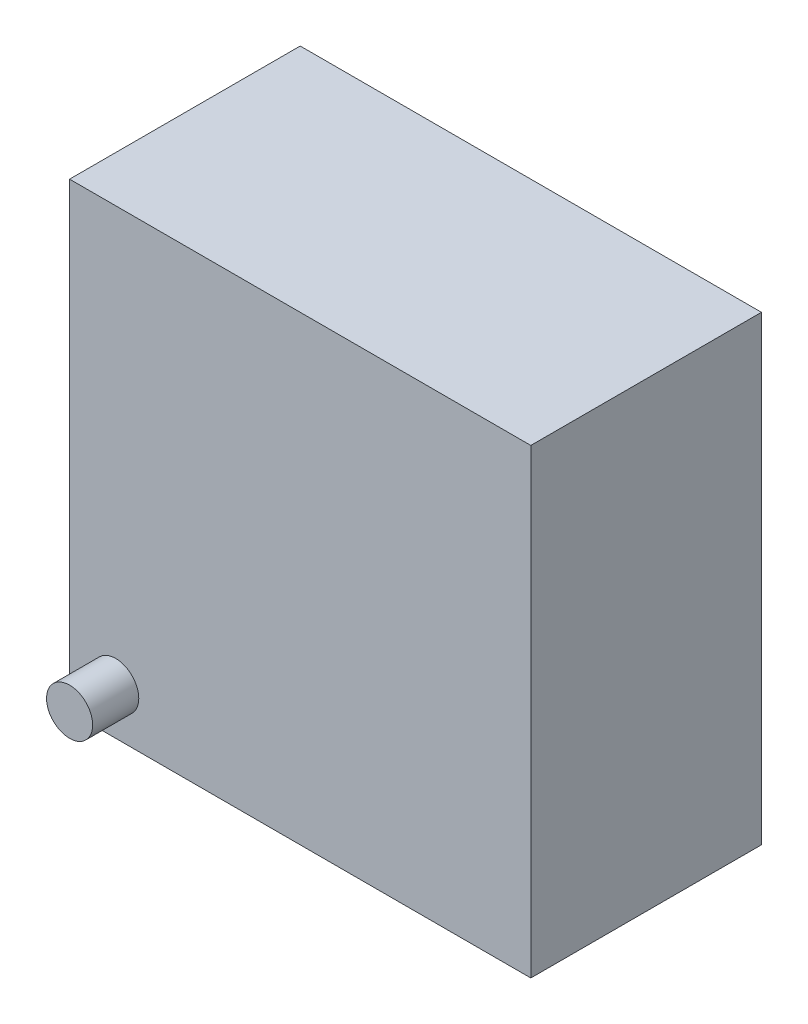
ISO-10303-21;
HEADER;
FILE_DESCRIPTION(('STEP AP214'),'2;1');
FILE_NAME('part.step','',(''),(''),'','','');
FILE_SCHEMA(('AUTOMOTIVE_DESIGN { 1 0 10303 214 1 1 1 1 }'));
ENDSEC;
DATA;
#1=APPLICATION_CONTEXT('core data for automotive mechanical design processes');
#2=APPLICATION_PROTOCOL_DEFINITION('international standard','automotive_design',2000,#1);
#3=PRODUCT_CONTEXT('',#1,'mechanical');
#4=PRODUCT('Part','Part','',(#3));
#5=PRODUCT_RELATED_PRODUCT_CATEGORY('part','',(#4));
#6=PRODUCT_DEFINITION_FORMATION('','',#4);
#7=PRODUCT_DEFINITION_CONTEXT('part definition',#1,'design');
#8=PRODUCT_DEFINITION('design','',#6,#7);
#9=PRODUCT_DEFINITION_SHAPE('','',#8);
#10=(LENGTH_UNIT() NAMED_UNIT(*) SI_UNIT(.MILLI.,.METRE.));
#11=(NAMED_UNIT(*) PLANE_ANGLE_UNIT() SI_UNIT($,.RADIAN.));
#12=(NAMED_UNIT(*) SI_UNIT($,.STERADIAN.) SOLID_ANGLE_UNIT());
#13=UNCERTAINTY_MEASURE_WITH_UNIT(LENGTH_MEASURE(1.E-05),#10,'distance_accuracy_value','');
#14=(GEOMETRIC_REPRESENTATION_CONTEXT(3) GLOBAL_UNCERTAINTY_ASSIGNED_CONTEXT((#13)) GLOBAL_UNIT_ASSIGNED_CONTEXT((#10,
#11,#12)) REPRESENTATION_CONTEXT('',''));
#15=CARTESIAN_POINT('',(0.,0.,0.));
#16=DIRECTION('',(0.,0.,1.));
#17=DIRECTION('',(1.,0.,0.));
#18=AXIS2_PLACEMENT_3D('',#15,#16,#17);
#19=CARTESIAN_POINT('',(0.,0.,10.));
#20=DIRECTION('',(1.,0.,0.));
#21=DIRECTION('',(0.,0.,-1.));
#22=AXIS2_PLACEMENT_3D('',#19,#20,#21);
#23=PLANE('',#22);
#24=DIRECTION('',(0.,-1.,0.));
#25=VECTOR('',#24,1.);
#26=CARTESIAN_POINT('',(0.,0.,0.));
#27=LINE('',#26,#25);
#28=CARTESIAN_POINT('',(0.,20.,0.));
#29=VERTEX_POINT('',#28);
#30=CARTESIAN_POINT('',(0.,0.,0.));
#31=VERTEX_POINT('',#30);
#32=EDGE_CURVE('E110',#29,#31,#27,.T.);
#33=ORIENTED_EDGE('',*,*,#32,.T.);
#34=DIRECTION('',(0.,0.,-1.));
#35=VECTOR('',#34,1.);
#36=CARTESIAN_POINT('',(0.,0.,10.));
#37=LINE('',#36,#35);
#38=CARTESIAN_POINT('',(0.,0.,10.));
#39=VERTEX_POINT('',#38);
#40=EDGE_CURVE('E42',#39,#31,#37,.T.);
#41=ORIENTED_EDGE('',*,*,#40,.F.);
#42=DIRECTION('',(0.,-1.,0.));
#43=VECTOR('',#42,1.);
#44=CARTESIAN_POINT('',(0.,0.,10.));
#45=LINE('',#44,#43);
#46=CARTESIAN_POINT('',(0.,20.,10.));
#47=VERTEX_POINT('',#46);
#48=EDGE_CURVE('E94',#47,#39,#45,.T.);
#49=ORIENTED_EDGE('',*,*,#48,.F.);
#50=DIRECTION('',(0.,0.,-1.));
#51=VECTOR('',#50,1.);
#52=CARTESIAN_POINT('',(0.,20.,10.));
#53=LINE('',#52,#51);
#54=EDGE_CURVE('E103',#47,#29,#53,.T.);
#55=ORIENTED_EDGE('',*,*,#54,.T.);
#56=EDGE_LOOP('',(#33,#41,#49,#55));
#57=FACE_BOUND('',#56,.T.);
#58=ADVANCED_FACE('F41',(#57),#23,.F.);
#59=CARTESIAN_POINT('',(0.,0.,10.));
#60=DIRECTION('',(0.,1.,0.));
#61=DIRECTION('',(0.,0.,1.));
#62=AXIS2_PLACEMENT_3D('',#59,#60,#61);
#63=PLANE('',#62);
#64=DIRECTION('',(1.,0.,0.));
#65=VECTOR('',#64,1.);
#66=CARTESIAN_POINT('',(0.,0.,0.));
#67=LINE('',#66,#65);
#68=CARTESIAN_POINT('',(20.,0.,0.));
#69=VERTEX_POINT('',#68);
#70=EDGE_CURVE('E97',#31,#69,#67,.T.);
#71=ORIENTED_EDGE('',*,*,#70,.T.);
#72=DIRECTION('',(0.,0.,-1.));
#73=VECTOR('',#72,1.);
#74=CARTESIAN_POINT('',(20.,0.,10.));
#75=LINE('',#74,#73);
#76=CARTESIAN_POINT('',(20.,0.,10.));
#77=VERTEX_POINT('',#76);
#78=EDGE_CURVE('E100',#77,#69,#75,.T.);
#79=ORIENTED_EDGE('',*,*,#78,.F.);
#80=DIRECTION('',(1.,0.,0.));
#81=VECTOR('',#80,1.);
#82=CARTESIAN_POINT('',(0.,0.,10.));
#83=LINE('',#82,#81);
#84=EDGE_CURVE('E90',#39,#77,#83,.T.);
#85=ORIENTED_EDGE('',*,*,#84,.F.);
#86=ORIENTED_EDGE('',*,*,#40,.T.);
#87=EDGE_LOOP('',(#71,#79,#85,#86));
#88=FACE_BOUND('',#87,.T.);
#89=ADVANCED_FACE('F98',(#88),#63,.F.);
#90=CARTESIAN_POINT('',(20.,0.,10.));
#91=DIRECTION('',(-1.,0.,0.));
#92=DIRECTION('',(0.,0.,1.));
#93=AXIS2_PLACEMENT_3D('',#90,#91,#92);
#94=PLANE('',#93);
#95=DIRECTION('',(0.,1.,0.));
#96=VECTOR('',#95,1.);
#97=CARTESIAN_POINT('',(20.,0.,0.));
#98=LINE('',#97,#96);
#99=CARTESIAN_POINT('',(20.,20.,0.));
#100=VERTEX_POINT('',#99);
#101=EDGE_CURVE('E73',#69,#100,#98,.T.);
#102=ORIENTED_EDGE('',*,*,#101,.T.);
#103=DIRECTION('',(0.,0.,-1.));
#104=VECTOR('',#103,1.);
#105=CARTESIAN_POINT('',(20.,20.,10.));
#106=LINE('',#105,#104);
#107=CARTESIAN_POINT('',(20.,20.,10.));
#108=VERTEX_POINT('',#107);
#109=EDGE_CURVE('E99',#108,#100,#106,.T.);
#110=ORIENTED_EDGE('',*,*,#109,.F.);
#111=DIRECTION('',(0.,1.,0.));
#112=VECTOR('',#111,1.);
#113=CARTESIAN_POINT('',(20.,0.,10.));
#114=LINE('',#113,#112);
#115=EDGE_CURVE('E95',#77,#108,#114,.T.);
#116=ORIENTED_EDGE('',*,*,#115,.F.);
#117=ORIENTED_EDGE('',*,*,#78,.T.);
#118=EDGE_LOOP('',(#102,#110,#116,#117));
#119=FACE_BOUND('',#118,.T.);
#120=ADVANCED_FACE('F101',(#119),#94,.F.);
#121=CARTESIAN_POINT('',(0.,20.,10.));
#122=DIRECTION('',(0.,-1.,0.));
#123=DIRECTION('',(0.,0.,-1.));
#124=AXIS2_PLACEMENT_3D('',#121,#122,#123);
#125=PLANE('',#124);
#126=DIRECTION('',(-1.,0.,0.));
#127=VECTOR('',#126,1.);
#128=CARTESIAN_POINT('',(0.,20.,0.));
#129=LINE('',#128,#127);
#130=EDGE_CURVE('E82',#100,#29,#129,.T.);
#131=ORIENTED_EDGE('',*,*,#130,.T.);
#132=ORIENTED_EDGE('',*,*,#54,.F.);
#133=DIRECTION('',(-1.,0.,0.));
#134=VECTOR('',#133,1.);
#135=CARTESIAN_POINT('',(0.,20.,10.));
#136=LINE('',#135,#134);
#137=EDGE_CURVE('E59',#108,#47,#136,.T.);
#138=ORIENTED_EDGE('',*,*,#137,.F.);
#139=ORIENTED_EDGE('',*,*,#109,.T.);
#140=EDGE_LOOP('',(#131,#132,#138,#139));
#141=FACE_BOUND('',#140,.T.);
#142=ADVANCED_FACE('F113',(#141),#125,.F.);
#143=CARTESIAN_POINT('',(0.,0.,10.));
#144=DIRECTION('',(0.,0.,-1.));
#145=DIRECTION('',(-1.,0.,0.));
#146=AXIS2_PLACEMENT_3D('',#143,#144,#145);
#147=PLANE('',#146);
#148=CARTESIAN_POINT('',(2.,2.,10.));
#149=DIRECTION('',(0.,0.,1.));
#150=DIRECTION('',(1.,0.,0.));
#151=AXIS2_PLACEMENT_3D('',#148,#149,#150);
#152=CIRCLE('',#151,1.);
#153=CARTESIAN_POINT('',(3.,2.,10.));
#154=VERTEX_POINT('',#153);
#155=EDGE_CURVE('E11',#154,#154,#152,.T.);
#156=ORIENTED_EDGE('',*,*,#155,.F.);
#157=EDGE_LOOP('',(#156));
#158=FACE_BOUND('',#157,.T.);
#159=ORIENTED_EDGE('',*,*,#48,.T.);
#160=ORIENTED_EDGE('',*,*,#84,.T.);
#161=ORIENTED_EDGE('',*,*,#115,.T.);
#162=ORIENTED_EDGE('',*,*,#137,.T.);
#163=EDGE_LOOP('',(#159,#160,#161,#162));
#164=FACE_BOUND('',#163,.T.);
#165=ADVANCED_FACE('F89',(#158,#164),#147,.F.);
#166=CARTESIAN_POINT('',(0.,0.,0.));
#167=DIRECTION('',(0.,0.,-1.));
#168=DIRECTION('',(-1.,0.,0.));
#169=AXIS2_PLACEMENT_3D('',#166,#167,#168);
#170=PLANE('',#169);
#171=ORIENTED_EDGE('',*,*,#32,.F.);
#172=ORIENTED_EDGE('',*,*,#130,.F.);
#173=ORIENTED_EDGE('',*,*,#101,.F.);
#174=ORIENTED_EDGE('',*,*,#70,.F.);
#175=EDGE_LOOP('',(#171,#172,#173,#174));
#176=FACE_BOUND('',#175,.T.);
#177=ADVANCED_FACE('F119',(#176),#170,.T.);
#178=CARTESIAN_POINT('',(2.,2.,12.));
#179=DIRECTION('',(0.,0.,-1.));
#180=DIRECTION('',(-1.,0.,0.));
#181=AXIS2_PLACEMENT_3D('',#178,#179,#180);
#182=CYLINDRICAL_SURFACE('',#181,1.);
#183=CARTESIAN_POINT('',(2.,2.,12.));
#184=DIRECTION('',(0.,0.,1.));
#185=DIRECTION('',(1.,0.,0.));
#186=AXIS2_PLACEMENT_3D('',#183,#184,#185);
#187=CIRCLE('',#186,1.);
#188=CARTESIAN_POINT('',(3.,2.,12.));
#189=VERTEX_POINT('',#188);
#190=EDGE_CURVE('E109',#189,#189,#187,.T.);
#191=ORIENTED_EDGE('',*,*,#190,.F.);
#192=EDGE_LOOP('',(#191));
#193=FACE_BOUND('',#192,.T.);
#194=ORIENTED_EDGE('',*,*,#155,.T.);
#195=EDGE_LOOP('',(#194));
#196=FACE_BOUND('',#195,.T.);
#197=ADVANCED_FACE('F127',(#193,#196),#182,.T.);
#198=CARTESIAN_POINT('',(2.,2.,12.));
#199=DIRECTION('',(0.,0.,1.));
#200=DIRECTION('',(1.,0.,0.));
#201=AXIS2_PLACEMENT_3D('',#198,#199,#200);
#202=PLANE('',#201);
#203=ORIENTED_EDGE('',*,*,#190,.T.);
#204=EDGE_LOOP('',(#203));
#205=FACE_BOUND('',#204,.T.);
#206=ADVANCED_FACE('F122',(#205),#202,.T.);
#207=CLOSED_SHELL('',(#58,#89,#120,#142,#165,#177,#197,#206));
#208=MANIFOLD_SOLID_BREP('B2',#207);
#209=ADVANCED_BREP_SHAPE_REPRESENTATION('',(#18,#208),#14);
#210=SHAPE_DEFINITION_REPRESENTATION(#9,#209);
ENDSEC;
END-ISO-10303-21;
